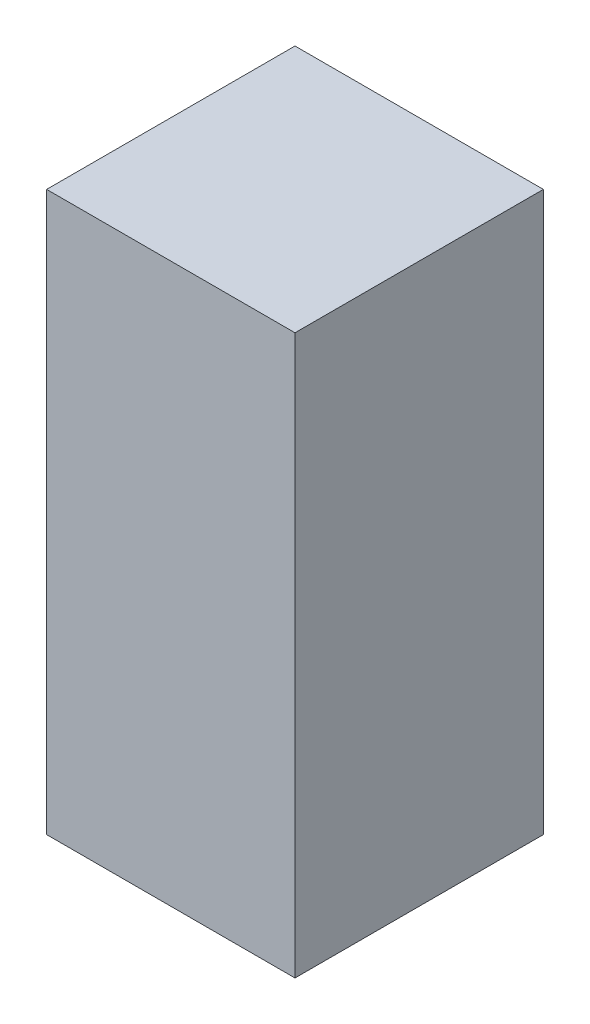
ISO-10303-21;
HEADER;
FILE_DESCRIPTION(('STEP AP214'),'2;1');
FILE_NAME('part.step','',(''),(''),'','','');
FILE_SCHEMA(('AUTOMOTIVE_DESIGN { 1 0 10303 214 1 1 1 1 }'));
ENDSEC;
DATA;
#1=APPLICATION_CONTEXT('core data for automotive mechanical design processes');
#2=APPLICATION_PROTOCOL_DEFINITION('international standard','automotive_design',2000,#1);
#3=PRODUCT_CONTEXT('',#1,'mechanical');
#4=PRODUCT('Part','Part','',(#3));
#5=PRODUCT_RELATED_PRODUCT_CATEGORY('part','',(#4));
#6=PRODUCT_DEFINITION_FORMATION('','',#4);
#7=PRODUCT_DEFINITION_CONTEXT('part definition',#1,'design');
#8=PRODUCT_DEFINITION('design','',#6,#7);
#9=PRODUCT_DEFINITION_SHAPE('','',#8);
#10=(LENGTH_UNIT() NAMED_UNIT(*) SI_UNIT(.MILLI.,.METRE.));
#11=(NAMED_UNIT(*) PLANE_ANGLE_UNIT() SI_UNIT($,.RADIAN.));
#12=(NAMED_UNIT(*) SI_UNIT($,.STERADIAN.) SOLID_ANGLE_UNIT());
#13=UNCERTAINTY_MEASURE_WITH_UNIT(LENGTH_MEASURE(1.E-05),#10,'distance_accuracy_value','');
#14=(GEOMETRIC_REPRESENTATION_CONTEXT(3) GLOBAL_UNCERTAINTY_ASSIGNED_CONTEXT((#13)) GLOBAL_UNIT_ASSIGNED_CONTEXT((#10,
#11,#12)) REPRESENTATION_CONTEXT('',''));
#15=CARTESIAN_POINT('',(0.,0.,0.));
#16=DIRECTION('',(0.,0.,1.));
#17=DIRECTION('',(1.,0.,0.));
#18=AXIS2_PLACEMENT_3D('',#15,#16,#17);
#19=CARTESIAN_POINT('',(0.,1371.6,0.));
#20=DIRECTION('',(1.,0.,0.));
#21=DIRECTION('',(0.,0.,-1.));
#22=AXIS2_PLACEMENT_3D('',#19,#20,#21);
#23=PLANE('',#22);
#24=DIRECTION('',(0.,0.,1.));
#25=VECTOR('',#24,1.);
#26=CARTESIAN_POINT('',(0.,0.,0.));
#27=LINE('',#26,#25);
#28=CARTESIAN_POINT('',(0.,0.,-609.6));
#29=VERTEX_POINT('',#28);
#30=CARTESIAN_POINT('',(0.,0.,0.));
#31=VERTEX_POINT('',#30);
#32=EDGE_CURVE('E107',#29,#31,#27,.T.);
#33=ORIENTED_EDGE('',*,*,#32,.T.);
#34=DIRECTION('',(0.,-1.,0.));
#35=VECTOR('',#34,1.);
#36=CARTESIAN_POINT('',(0.,1371.6,0.));
#37=LINE('',#36,#35);
#38=CARTESIAN_POINT('',(0.,1371.6,0.));
#39=VERTEX_POINT('',#38);
#40=EDGE_CURVE('E11',#39,#31,#37,.T.);
#41=ORIENTED_EDGE('',*,*,#40,.F.);
#42=DIRECTION('',(0.,0.,1.));
#43=VECTOR('',#42,1.);
#44=CARTESIAN_POINT('',(0.,1371.6,0.));
#45=LINE('',#44,#43);
#46=CARTESIAN_POINT('',(0.,1371.6,-609.6));
#47=VERTEX_POINT('',#46);
#48=EDGE_CURVE('E91',#47,#39,#45,.T.);
#49=ORIENTED_EDGE('',*,*,#48,.F.);
#50=DIRECTION('',(0.,-1.,0.));
#51=VECTOR('',#50,1.);
#52=CARTESIAN_POINT('',(0.,1371.6,-609.6));
#53=LINE('',#52,#51);
#54=EDGE_CURVE('E103',#47,#29,#53,.T.);
#55=ORIENTED_EDGE('',*,*,#54,.T.);
#56=EDGE_LOOP('',(#33,#41,#49,#55));
#57=FACE_BOUND('',#56,.T.);
#58=ADVANCED_FACE('F39',(#57),#23,.F.);
#59=CARTESIAN_POINT('',(0.,1371.6,0.));
#60=DIRECTION('',(0.,0.,-1.));
#61=DIRECTION('',(-1.,0.,0.));
#62=AXIS2_PLACEMENT_3D('',#59,#60,#61);
#63=PLANE('',#62);
#64=DIRECTION('',(1.,0.,0.));
#65=VECTOR('',#64,1.);
#66=CARTESIAN_POINT('',(0.,0.,0.));
#67=LINE('',#66,#65);
#68=CARTESIAN_POINT('',(609.6,0.,0.));
#69=VERTEX_POINT('',#68);
#70=EDGE_CURVE('E96',#31,#69,#67,.T.);
#71=ORIENTED_EDGE('',*,*,#70,.T.);
#72=DIRECTION('',(0.,-1.,0.));
#73=VECTOR('',#72,1.);
#74=CARTESIAN_POINT('',(609.6,1371.6,0.));
#75=LINE('',#74,#73);
#76=CARTESIAN_POINT('',(609.6,1371.6,0.));
#77=VERTEX_POINT('',#76);
#78=EDGE_CURVE('E48',#77,#69,#75,.T.);
#79=ORIENTED_EDGE('',*,*,#78,.F.);
#80=DIRECTION('',(1.,0.,0.));
#81=VECTOR('',#80,1.);
#82=CARTESIAN_POINT('',(0.,1371.6,0.));
#83=LINE('',#82,#81);
#84=EDGE_CURVE('E86',#39,#77,#83,.T.);
#85=ORIENTED_EDGE('',*,*,#84,.F.);
#86=ORIENTED_EDGE('',*,*,#40,.T.);
#87=EDGE_LOOP('',(#71,#79,#85,#86));
#88=FACE_BOUND('',#87,.T.);
#89=ADVANCED_FACE('F95',(#88),#63,.F.);
#90=CARTESIAN_POINT('',(609.6,1371.6,0.));
#91=DIRECTION('',(-1.,0.,0.));
#92=DIRECTION('',(0.,0.,1.));
#93=AXIS2_PLACEMENT_3D('',#90,#91,#92);
#94=PLANE('',#93);
#95=DIRECTION('',(0.,0.,-1.));
#96=VECTOR('',#95,1.);
#97=CARTESIAN_POINT('',(609.6,0.,0.));
#98=LINE('',#97,#96);
#99=CARTESIAN_POINT('',(609.6,0.,-609.6));
#100=VERTEX_POINT('',#99);
#101=EDGE_CURVE('E73',#69,#100,#98,.T.);
#102=ORIENTED_EDGE('',*,*,#101,.T.);
#103=DIRECTION('',(0.,-1.,0.));
#104=VECTOR('',#103,1.);
#105=CARTESIAN_POINT('',(609.6,1371.6,-609.6));
#106=LINE('',#105,#104);
#107=CARTESIAN_POINT('',(609.6,1371.6,-609.6));
#108=VERTEX_POINT('',#107);
#109=EDGE_CURVE('E98',#108,#100,#106,.T.);
#110=ORIENTED_EDGE('',*,*,#109,.F.);
#111=DIRECTION('',(0.,0.,-1.));
#112=VECTOR('',#111,1.);
#113=CARTESIAN_POINT('',(609.6,1371.6,0.));
#114=LINE('',#113,#112);
#115=EDGE_CURVE('E89',#77,#108,#114,.T.);
#116=ORIENTED_EDGE('',*,*,#115,.F.);
#117=ORIENTED_EDGE('',*,*,#78,.T.);
#118=EDGE_LOOP('',(#102,#110,#116,#117));
#119=FACE_BOUND('',#118,.T.);
#120=ADVANCED_FACE('F99',(#119),#94,.F.);
#121=CARTESIAN_POINT('',(0.,1371.6,-609.6));
#122=DIRECTION('',(0.,0.,1.));
#123=DIRECTION('',(1.,0.,0.));
#124=AXIS2_PLACEMENT_3D('',#121,#122,#123);
#125=PLANE('',#124);
#126=DIRECTION('',(-1.,0.,0.));
#127=VECTOR('',#126,1.);
#128=CARTESIAN_POINT('',(0.,0.,-609.6));
#129=LINE('',#128,#127);
#130=EDGE_CURVE('E79',#100,#29,#129,.T.);
#131=ORIENTED_EDGE('',*,*,#130,.T.);
#132=ORIENTED_EDGE('',*,*,#54,.F.);
#133=DIRECTION('',(-1.,0.,0.));
#134=VECTOR('',#133,1.);
#135=CARTESIAN_POINT('',(0.,1371.6,-609.6));
#136=LINE('',#135,#134);
#137=EDGE_CURVE('E56',#108,#47,#136,.T.);
#138=ORIENTED_EDGE('',*,*,#137,.F.);
#139=ORIENTED_EDGE('',*,*,#109,.T.);
#140=EDGE_LOOP('',(#131,#132,#138,#139));
#141=FACE_BOUND('',#140,.T.);
#142=ADVANCED_FACE('F120',(#141),#125,.F.);
#143=CARTESIAN_POINT('',(0.,1371.6,0.));
#144=DIRECTION('',(0.,-1.,0.));
#145=DIRECTION('',(0.,0.,-1.));
#146=AXIS2_PLACEMENT_3D('',#143,#144,#145);
#147=PLANE('',#146);
#148=ORIENTED_EDGE('',*,*,#48,.T.);
#149=ORIENTED_EDGE('',*,*,#84,.T.);
#150=ORIENTED_EDGE('',*,*,#115,.T.);
#151=ORIENTED_EDGE('',*,*,#137,.T.);
#152=EDGE_LOOP('',(#148,#149,#150,#151));
#153=FACE_BOUND('',#152,.T.);
#154=ADVANCED_FACE('F87',(#153),#147,.F.);
#155=CARTESIAN_POINT('',(0.,0.,0.));
#156=DIRECTION('',(0.,-1.,0.));
#157=DIRECTION('',(0.,0.,-1.));
#158=AXIS2_PLACEMENT_3D('',#155,#156,#157);
#159=PLANE('',#158);
#160=ORIENTED_EDGE('',*,*,#32,.F.);
#161=ORIENTED_EDGE('',*,*,#130,.F.);
#162=ORIENTED_EDGE('',*,*,#101,.F.);
#163=ORIENTED_EDGE('',*,*,#70,.F.);
#164=EDGE_LOOP('',(#160,#161,#162,#163));
#165=FACE_BOUND('',#164,.T.);
#166=ADVANCED_FACE('F123',(#165),#159,.T.);
#167=CLOSED_SHELL('',(#58,#89,#120,#142,#154,#166));
#168=MANIFOLD_SOLID_BREP('B2',#167);
#169=ADVANCED_BREP_SHAPE_REPRESENTATION('',(#18,#168),#14);
#170=SHAPE_DEFINITION_REPRESENTATION(#9,#169);
ENDSEC;
END-ISO-10303-21;
